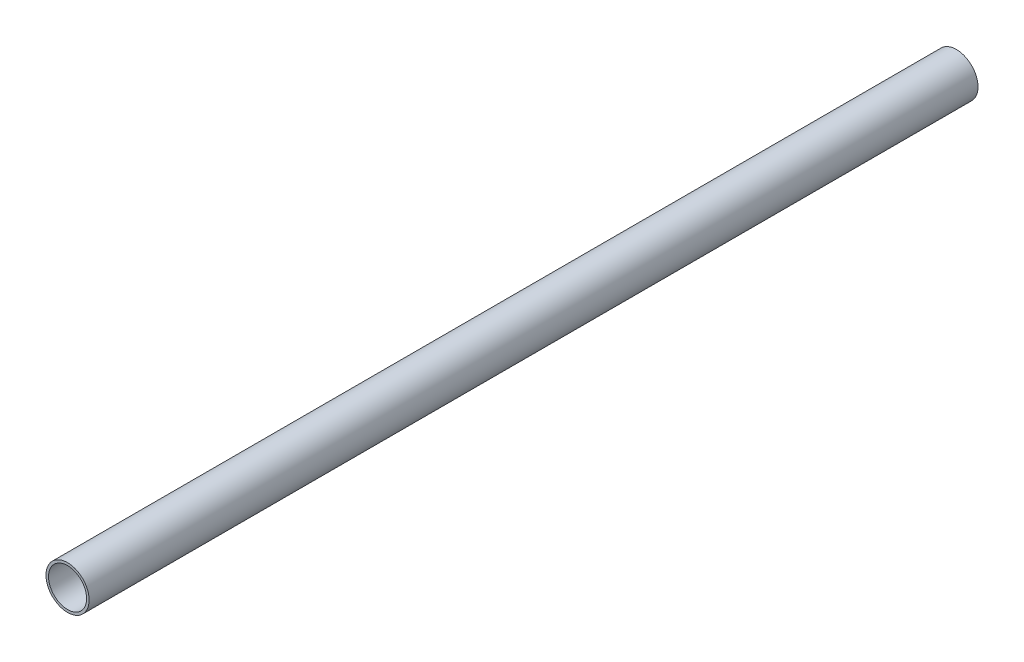
ISO-10303-21;
HEADER;
FILE_DESCRIPTION(('STEP AP214'),'2;1');
FILE_NAME('part.step','',(''),(''),'','','');
FILE_SCHEMA(('AUTOMOTIVE_DESIGN { 1 0 10303 214 1 1 1 1 }'));
ENDSEC;
DATA;
#1=APPLICATION_CONTEXT('core data for automotive mechanical design processes');
#2=APPLICATION_PROTOCOL_DEFINITION('international standard','automotive_design',2000,#1);
#3=PRODUCT_CONTEXT('',#1,'mechanical');
#4=PRODUCT('Part','Part','',(#3));
#5=PRODUCT_RELATED_PRODUCT_CATEGORY('part','',(#4));
#6=PRODUCT_DEFINITION_FORMATION('','',#4);
#7=PRODUCT_DEFINITION_CONTEXT('part definition',#1,'design');
#8=PRODUCT_DEFINITION('design','',#6,#7);
#9=PRODUCT_DEFINITION_SHAPE('','',#8);
#10=(LENGTH_UNIT() NAMED_UNIT(*) SI_UNIT(.MILLI.,.METRE.));
#11=(NAMED_UNIT(*) PLANE_ANGLE_UNIT() SI_UNIT($,.RADIAN.));
#12=(NAMED_UNIT(*) SI_UNIT($,.STERADIAN.) SOLID_ANGLE_UNIT());
#13=UNCERTAINTY_MEASURE_WITH_UNIT(LENGTH_MEASURE(1.E-05),#10,'distance_accuracy_value','');
#14=(GEOMETRIC_REPRESENTATION_CONTEXT(3) GLOBAL_UNCERTAINTY_ASSIGNED_CONTEXT((#13)) GLOBAL_UNIT_ASSIGNED_CONTEXT((#10,
#11,#12)) REPRESENTATION_CONTEXT('',''));
#15=CARTESIAN_POINT('',(0.,0.,0.));
#16=DIRECTION('',(0.,0.,1.));
#17=DIRECTION('',(1.,0.,0.));
#18=AXIS2_PLACEMENT_3D('',#15,#16,#17);
#19=CARTESIAN_POINT('',(0.,0.,700.));
#20=DIRECTION('',(0.,0.,1.));
#21=DIRECTION('',(1.,0.,0.));
#22=AXIS2_PLACEMENT_3D('',#19,#20,#21);
#23=PLANE('',#22);
#24=CARTESIAN_POINT('',(0.,0.,700.));
#25=DIRECTION('',(0.,0.,1.));
#26=DIRECTION('',(1.,0.,0.));
#27=AXIS2_PLACEMENT_3D('',#24,#25,#26);
#28=CIRCLE('',#27,17.);
#29=CARTESIAN_POINT('',(17.,0.,700.));
#30=VERTEX_POINT('',#29);
#31=EDGE_CURVE('E10',#30,#30,#28,.T.);
#32=ORIENTED_EDGE('',*,*,#31,.T.);
#33=EDGE_LOOP('',(#32));
#34=FACE_BOUND('',#33,.T.);
#35=CARTESIAN_POINT('',(0.,0.,700.));
#36=DIRECTION('',(0.,0.,1.));
#37=DIRECTION('',(1.,0.,0.));
#38=AXIS2_PLACEMENT_3D('',#35,#36,#37);
#39=CIRCLE('',#38,15.);
#40=CARTESIAN_POINT('',(15.,0.,700.));
#41=VERTEX_POINT('',#40);
#42=EDGE_CURVE('E43',#41,#41,#39,.T.);
#43=ORIENTED_EDGE('',*,*,#42,.F.);
#44=EDGE_LOOP('',(#43));
#45=FACE_BOUND('',#44,.T.);
#46=ADVANCED_FACE('F32',(#34,#45),#23,.T.);
#47=CARTESIAN_POINT('',(0.,0.,0.));
#48=DIRECTION('',(0.,0.,1.));
#49=DIRECTION('',(1.,0.,0.));
#50=AXIS2_PLACEMENT_3D('',#47,#48,#49);
#51=PLANE('',#50);
#52=CARTESIAN_POINT('',(0.,0.,0.));
#53=DIRECTION('',(0.,0.,1.));
#54=DIRECTION('',(1.,0.,0.));
#55=AXIS2_PLACEMENT_3D('',#52,#53,#54);
#56=CIRCLE('',#55,17.);
#57=CARTESIAN_POINT('',(17.,0.,0.));
#58=VERTEX_POINT('',#57);
#59=EDGE_CURVE('E36',#58,#58,#56,.T.);
#60=ORIENTED_EDGE('',*,*,#59,.F.);
#61=EDGE_LOOP('',(#60));
#62=FACE_BOUND('',#61,.T.);
#63=CARTESIAN_POINT('',(0.,0.,0.));
#64=DIRECTION('',(0.,0.,1.));
#65=DIRECTION('',(1.,0.,0.));
#66=AXIS2_PLACEMENT_3D('',#63,#64,#65);
#67=CIRCLE('',#66,15.);
#68=CARTESIAN_POINT('',(15.,0.,0.));
#69=VERTEX_POINT('',#68);
#70=EDGE_CURVE('E45',#69,#69,#67,.T.);
#71=ORIENTED_EDGE('',*,*,#70,.T.);
#72=EDGE_LOOP('',(#71));
#73=FACE_BOUND('',#72,.T.);
#74=ADVANCED_FACE('F55',(#62,#73),#51,.F.);
#75=CARTESIAN_POINT('',(0.,0.,700.));
#76=DIRECTION('',(0.,0.,-1.));
#77=DIRECTION('',(-1.,0.,0.));
#78=AXIS2_PLACEMENT_3D('',#75,#76,#77);
#79=CYLINDRICAL_SURFACE('',#78,17.);
#80=ORIENTED_EDGE('',*,*,#31,.F.);
#81=EDGE_LOOP('',(#80));
#82=FACE_BOUND('',#81,.T.);
#83=ORIENTED_EDGE('',*,*,#59,.T.);
#84=EDGE_LOOP('',(#83));
#85=FACE_BOUND('',#84,.T.);
#86=ADVANCED_FACE('F34',(#82,#85),#79,.T.);
#87=CARTESIAN_POINT('',(0.,0.,700.));
#88=DIRECTION('',(0.,0.,-1.));
#89=DIRECTION('',(-1.,0.,0.));
#90=AXIS2_PLACEMENT_3D('',#87,#88,#89);
#91=CYLINDRICAL_SURFACE('',#90,15.);
#92=ORIENTED_EDGE('',*,*,#42,.T.);
#93=EDGE_LOOP('',(#92));
#94=FACE_BOUND('',#93,.T.);
#95=ORIENTED_EDGE('',*,*,#70,.F.);
#96=EDGE_LOOP('',(#95));
#97=FACE_BOUND('',#96,.T.);
#98=ADVANCED_FACE('F51',(#94,#97),#91,.F.);
#99=CLOSED_SHELL('',(#46,#74,#86,#98));
#100=MANIFOLD_SOLID_BREP('B2',#99);
#101=ADVANCED_BREP_SHAPE_REPRESENTATION('',(#18,#100),#14);
#102=SHAPE_DEFINITION_REPRESENTATION(#9,#101);
ENDSEC;
END-ISO-10303-21;
